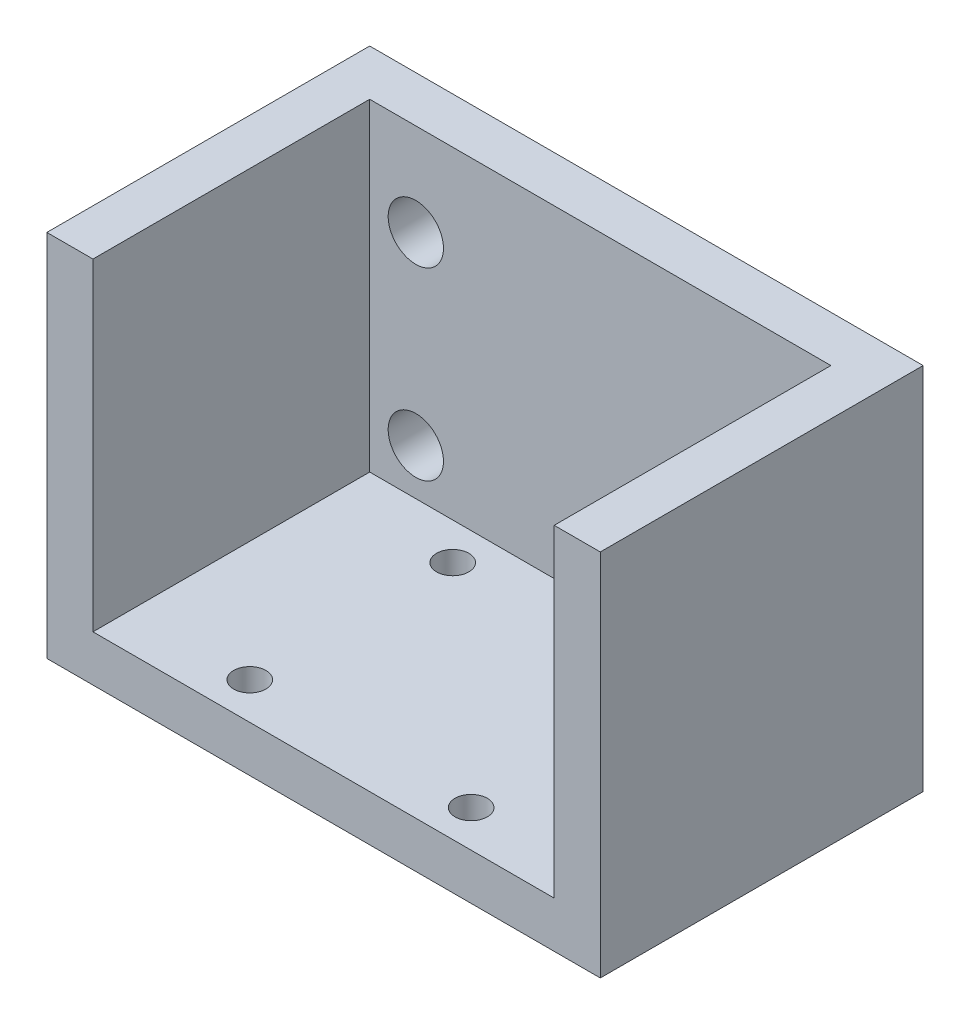
ISO-10303-21;
HEADER;
FILE_DESCRIPTION(('STEP AP214'),'2;1');
FILE_NAME('part.step','',(''),(''),'','','');
FILE_SCHEMA(('AUTOMOTIVE_DESIGN { 1 0 10303 214 1 1 1 1 }'));
ENDSEC;
DATA;
#1=APPLICATION_CONTEXT('core data for automotive mechanical design processes');
#2=APPLICATION_PROTOCOL_DEFINITION('international standard','automotive_design',2000,#1);
#3=PRODUCT_CONTEXT('',#1,'mechanical');
#4=PRODUCT('Part','Part','',(#3));
#5=PRODUCT_RELATED_PRODUCT_CATEGORY('part','',(#4));
#6=PRODUCT_DEFINITION_FORMATION('','',#4);
#7=PRODUCT_DEFINITION_CONTEXT('part definition',#1,'design');
#8=PRODUCT_DEFINITION('design','',#6,#7);
#9=PRODUCT_DEFINITION_SHAPE('','',#8);
#10=(LENGTH_UNIT() NAMED_UNIT(*) SI_UNIT(.MILLI.,.METRE.));
#11=(NAMED_UNIT(*) PLANE_ANGLE_UNIT() SI_UNIT($,.RADIAN.));
#12=(NAMED_UNIT(*) SI_UNIT($,.STERADIAN.) SOLID_ANGLE_UNIT());
#13=UNCERTAINTY_MEASURE_WITH_UNIT(LENGTH_MEASURE(1.E-05),#10,'distance_accuracy_value','');
#14=(GEOMETRIC_REPRESENTATION_CONTEXT(3) GLOBAL_UNCERTAINTY_ASSIGNED_CONTEXT((#13)) GLOBAL_UNIT_ASSIGNED_CONTEXT((#10,
#11,#12)) REPRESENTATION_CONTEXT('',''));
#15=CARTESIAN_POINT('',(0.,0.,0.));
#16=DIRECTION('',(0.,0.,1.));
#17=DIRECTION('',(1.,0.,0.));
#18=AXIS2_PLACEMENT_3D('',#15,#16,#17);
#19=CARTESIAN_POINT('',(0.,5.,0.));
#20=DIRECTION('',(0.,-1.,0.));
#21=DIRECTION('',(0.,0.,-1.));
#22=AXIS2_PLACEMENT_3D('',#19,#20,#21);
#23=PLANE('',#22);
#24=CARTESIAN_POINT('',(18.,5.,-26.));
#25=DIRECTION('',(0.,-1.,0.));
#26=DIRECTION('',(0.,0.,-1.));
#27=AXIS2_PLACEMENT_3D('',#24,#25,#26);
#28=CIRCLE('',#27,1.75);
#29=CARTESIAN_POINT('',(18.,5.,-27.75));
#30=VERTEX_POINT('',#29);
#31=EDGE_CURVE('E361',#30,#30,#28,.F.);
#32=ORIENTED_EDGE('',*,*,#31,.F.);
#33=EDGE_LOOP('',(#32));
#34=FACE_BOUND('',#33,.T.);
#35=CARTESIAN_POINT('',(18.,5.,-4.00000000000001));
#36=DIRECTION('',(0.,-1.,0.));
#37=DIRECTION('',(0.,0.,-1.));
#38=AXIS2_PLACEMENT_3D('',#35,#36,#37);
#39=CIRCLE('',#38,1.75);
#40=CARTESIAN_POINT('',(18.,5.,-5.75000000000001));
#41=VERTEX_POINT('',#40);
#42=EDGE_CURVE('E365',#41,#41,#39,.F.);
#43=ORIENTED_EDGE('',*,*,#42,.F.);
#44=EDGE_LOOP('',(#43));
#45=FACE_BOUND('',#44,.T.);
#46=CARTESIAN_POINT('',(42.,5.,-4.00000000000001));
#47=DIRECTION('',(0.,-1.,0.));
#48=DIRECTION('',(0.,0.,-1.));
#49=AXIS2_PLACEMENT_3D('',#46,#47,#48);
#50=CIRCLE('',#49,1.75);
#51=CARTESIAN_POINT('',(42.,5.,-5.75000000000001));
#52=VERTEX_POINT('',#51);
#53=EDGE_CURVE('E374',#52,#52,#50,.F.);
#54=ORIENTED_EDGE('',*,*,#53,.F.);
#55=EDGE_LOOP('',(#54));
#56=FACE_BOUND('',#55,.T.);
#57=CARTESIAN_POINT('',(42.,5.,-26.));
#58=DIRECTION('',(0.,-1.,0.));
#59=DIRECTION('',(0.,0.,-1.));
#60=AXIS2_PLACEMENT_3D('',#57,#58,#59);
#61=CIRCLE('',#60,1.75);
#62=CARTESIAN_POINT('',(42.,5.,-27.75));
#63=VERTEX_POINT('',#62);
#64=EDGE_CURVE('E383',#63,#63,#61,.F.);
#65=ORIENTED_EDGE('',*,*,#64,.F.);
#66=EDGE_LOOP('',(#65));
#67=FACE_BOUND('',#66,.T.);
#68=DIRECTION('',(0.,0.,-1.));
#69=VECTOR('',#68,1.);
#70=CARTESIAN_POINT('',(5.00000000000001,5.,0.));
#71=LINE('',#70,#69);
#72=CARTESIAN_POINT('',(5.00000000000001,5.,0.));
#73=VERTEX_POINT('',#72);
#74=CARTESIAN_POINT('',(5.,5.,-30.));
#75=VERTEX_POINT('',#74);
#76=EDGE_CURVE('E121',#73,#75,#71,.T.);
#77=ORIENTED_EDGE('',*,*,#76,.F.);
#78=DIRECTION('',(1.,0.,0.));
#79=VECTOR('',#78,1.);
#80=CARTESIAN_POINT('',(0.,5.,0.));
#81=LINE('',#80,#79);
#82=CARTESIAN_POINT('',(55.,5.,0.));
#83=VERTEX_POINT('',#82);
#84=EDGE_CURVE('E54',#73,#83,#81,.T.);
#85=ORIENTED_EDGE('',*,*,#84,.T.);
#86=DIRECTION('',(0.,0.,1.));
#87=VECTOR('',#86,1.);
#88=CARTESIAN_POINT('',(55.,5.,-30.));
#89=LINE('',#88,#87);
#90=CARTESIAN_POINT('',(55.,5.,-30.));
#91=VERTEX_POINT('',#90);
#92=EDGE_CURVE('E118',#91,#83,#89,.T.);
#93=ORIENTED_EDGE('',*,*,#92,.F.);
#94=DIRECTION('',(1.,0.,0.));
#95=VECTOR('',#94,1.);
#96=CARTESIAN_POINT('',(5.,5.,-30.));
#97=LINE('',#96,#95);
#98=EDGE_CURVE('E49',#75,#91,#97,.T.);
#99=ORIENTED_EDGE('',*,*,#98,.F.);
#100=EDGE_LOOP('',(#77,#85,#93,#99));
#101=FACE_BOUND('',#100,.T.);
#102=ADVANCED_FACE('F34',(#34,#45,#56,#67,#101),#23,.F.);
#103=CARTESIAN_POINT('',(0.,5.,0.));
#104=DIRECTION('',(1.,0.,0.));
#105=DIRECTION('',(0.,0.,-1.));
#106=AXIS2_PLACEMENT_3D('',#103,#104,#105);
#107=PLANE('',#106);
#108=DIRECTION('',(0.,0.,1.));
#109=VECTOR('',#108,1.);
#110=CARTESIAN_POINT('',(0.,0.,0.));
#111=LINE('',#110,#109);
#112=CARTESIAN_POINT('',(0.,0.,-35.));
#113=VERTEX_POINT('',#112);
#114=CARTESIAN_POINT('',(0.,0.,0.));
#115=VERTEX_POINT('',#114);
#116=EDGE_CURVE('E122',#113,#115,#111,.T.);
#117=ORIENTED_EDGE('',*,*,#116,.T.);
#118=DIRECTION('',(0.,-1.,0.));
#119=VECTOR('',#118,1.);
#120=CARTESIAN_POINT('',(0.,5.,0.));
#121=LINE('',#120,#119);
#122=CARTESIAN_POINT('',(0.,40.,0.));
#123=VERTEX_POINT('',#122);
#124=EDGE_CURVE('E11',#123,#115,#121,.T.);
#125=ORIENTED_EDGE('',*,*,#124,.F.);
#126=DIRECTION('',(0.,0.,1.));
#127=VECTOR('',#126,1.);
#128=CARTESIAN_POINT('',(0.,40.,-35.));
#129=LINE('',#128,#127);
#130=CARTESIAN_POINT('',(0.,40.,-35.));
#131=VERTEX_POINT('',#130);
#132=EDGE_CURVE('E162',#131,#123,#129,.T.);
#133=ORIENTED_EDGE('',*,*,#132,.F.);
#134=DIRECTION('',(0.,-1.,0.));
#135=VECTOR('',#134,1.);
#136=CARTESIAN_POINT('',(0.,5.,-35.));
#137=LINE('',#136,#135);
#138=EDGE_CURVE('E131',#131,#113,#137,.T.);
#139=ORIENTED_EDGE('',*,*,#138,.T.);
#140=EDGE_LOOP('',(#117,#125,#133,#139));
#141=FACE_BOUND('',#140,.T.);
#142=ADVANCED_FACE('F36',(#141),#107,.F.);
#143=CARTESIAN_POINT('',(0.,5.,0.));
#144=DIRECTION('',(0.,0.,-1.));
#145=DIRECTION('',(-1.,0.,0.));
#146=AXIS2_PLACEMENT_3D('',#143,#144,#145);
#147=PLANE('',#146);
#148=DIRECTION('',(1.,0.,0.));
#149=VECTOR('',#148,1.);
#150=CARTESIAN_POINT('',(0.,0.,0.));
#151=LINE('',#150,#149);
#152=CARTESIAN_POINT('',(60.,0.,0.));
#153=VERTEX_POINT('',#152);
#154=EDGE_CURVE('E125',#115,#153,#151,.T.);
#155=ORIENTED_EDGE('',*,*,#154,.T.);
#156=DIRECTION('',(0.,-1.,0.));
#157=VECTOR('',#156,1.);
#158=CARTESIAN_POINT('',(60.,5.,0.));
#159=LINE('',#158,#157);
#160=CARTESIAN_POINT('',(60.,40.,0.));
#161=VERTEX_POINT('',#160);
#162=EDGE_CURVE('E42',#161,#153,#159,.T.);
#163=ORIENTED_EDGE('',*,*,#162,.F.);
#164=DIRECTION('',(1.,0.,0.));
#165=VECTOR('',#164,1.);
#166=CARTESIAN_POINT('',(55.,40.,0.));
#167=LINE('',#166,#165);
#168=CARTESIAN_POINT('',(55.,40.,0.));
#169=VERTEX_POINT('',#168);
#170=EDGE_CURVE('E177',#169,#161,#167,.T.);
#171=ORIENTED_EDGE('',*,*,#170,.F.);
#172=DIRECTION('',(0.,-1.,0.));
#173=VECTOR('',#172,1.);
#174=CARTESIAN_POINT('',(55.,40.,0.));
#175=LINE('',#174,#173);
#176=EDGE_CURVE('E127',#169,#83,#175,.T.);
#177=ORIENTED_EDGE('',*,*,#176,.T.);
#178=ORIENTED_EDGE('',*,*,#84,.F.);
#179=DIRECTION('',(0.,-1.,0.));
#180=VECTOR('',#179,1.);
#181=CARTESIAN_POINT('',(5.00000000000001,40.,0.));
#182=LINE('',#181,#180);
#183=CARTESIAN_POINT('',(5.00000000000001,40.,0.));
#184=VERTEX_POINT('',#183);
#185=EDGE_CURVE('E165',#184,#73,#182,.T.);
#186=ORIENTED_EDGE('',*,*,#185,.F.);
#187=DIRECTION('',(1.,0.,0.));
#188=VECTOR('',#187,1.);
#189=CARTESIAN_POINT('',(0.,40.,0.));
#190=LINE('',#189,#188);
#191=EDGE_CURVE('E114',#123,#184,#190,.T.);
#192=ORIENTED_EDGE('',*,*,#191,.F.);
#193=ORIENTED_EDGE('',*,*,#124,.T.);
#194=EDGE_LOOP('',(#155,#163,#171,#177,#178,#186,#192,#193));
#195=FACE_BOUND('',#194,.T.);
#196=ADVANCED_FACE('F176',(#195),#147,.F.);
#197=CARTESIAN_POINT('',(60.,5.,0.));
#198=DIRECTION('',(-1.,0.,0.));
#199=DIRECTION('',(0.,0.,1.));
#200=AXIS2_PLACEMENT_3D('',#197,#198,#199);
#201=PLANE('',#200);
#202=DIRECTION('',(0.,0.,-1.));
#203=VECTOR('',#202,1.);
#204=CARTESIAN_POINT('',(60.,0.,0.));
#205=LINE('',#204,#203);
#206=CARTESIAN_POINT('',(60.,0.,-35.));
#207=VERTEX_POINT('',#206);
#208=EDGE_CURVE('E135',#153,#207,#205,.T.);
#209=ORIENTED_EDGE('',*,*,#208,.T.);
#210=DIRECTION('',(0.,-1.,0.));
#211=VECTOR('',#210,1.);
#212=CARTESIAN_POINT('',(60.,5.,-35.));
#213=LINE('',#212,#211);
#214=CARTESIAN_POINT('',(60.,40.,-35.));
#215=VERTEX_POINT('',#214);
#216=EDGE_CURVE('E140',#215,#207,#213,.T.);
#217=ORIENTED_EDGE('',*,*,#216,.F.);
#218=DIRECTION('',(0.,0.,-1.));
#219=VECTOR('',#218,1.);
#220=CARTESIAN_POINT('',(60.,40.,0.));
#221=LINE('',#220,#219);
#222=EDGE_CURVE('E148',#161,#215,#221,.T.);
#223=ORIENTED_EDGE('',*,*,#222,.F.);
#224=ORIENTED_EDGE('',*,*,#162,.T.);
#225=EDGE_LOOP('',(#209,#217,#223,#224));
#226=FACE_BOUND('',#225,.T.);
#227=ADVANCED_FACE('F146',(#226),#201,.F.);
#228=CARTESIAN_POINT('',(0.,5.,-35.));
#229=DIRECTION('',(0.,0.,1.));
#230=DIRECTION('',(1.,0.,0.));
#231=AXIS2_PLACEMENT_3D('',#228,#229,#230);
#232=PLANE('',#231);
#233=CARTESIAN_POINT('',(10.,30.,-35.));
#234=DIRECTION('',(0.,0.,-1.));
#235=DIRECTION('',(-1.,0.,0.));
#236=AXIS2_PLACEMENT_3D('',#233,#234,#235);
#237=CIRCLE('',#236,3.);
#238=CARTESIAN_POINT('',(7.,30.,-35.));
#239=VERTEX_POINT('',#238);
#240=EDGE_CURVE('E387',#239,#239,#237,.T.);
#241=ORIENTED_EDGE('',*,*,#240,.F.);
#242=EDGE_LOOP('',(#241));
#243=FACE_BOUND('',#242,.T.);
#244=CARTESIAN_POINT('',(50.,30.,-35.));
#245=DIRECTION('',(0.,0.,-1.));
#246=DIRECTION('',(-1.,0.,0.));
#247=AXIS2_PLACEMENT_3D('',#244,#245,#246);
#248=CIRCLE('',#247,3.);
#249=CARTESIAN_POINT('',(47.,30.,-35.));
#250=VERTEX_POINT('',#249);
#251=EDGE_CURVE('E395',#250,#250,#248,.T.);
#252=ORIENTED_EDGE('',*,*,#251,.F.);
#253=EDGE_LOOP('',(#252));
#254=FACE_BOUND('',#253,.T.);
#255=CARTESIAN_POINT('',(50.,10.,-35.));
#256=DIRECTION('',(0.,0.,-1.));
#257=DIRECTION('',(-1.,0.,0.));
#258=AXIS2_PLACEMENT_3D('',#255,#256,#257);
#259=CIRCLE('',#258,3.);
#260=CARTESIAN_POINT('',(47.,10.,-35.));
#261=VERTEX_POINT('',#260);
#262=EDGE_CURVE('E386',#261,#261,#259,.T.);
#263=ORIENTED_EDGE('',*,*,#262,.F.);
#264=EDGE_LOOP('',(#263));
#265=FACE_BOUND('',#264,.T.);
#266=CARTESIAN_POINT('',(10.,10.,-35.));
#267=DIRECTION('',(0.,0.,-1.));
#268=DIRECTION('',(-1.,0.,0.));
#269=AXIS2_PLACEMENT_3D('',#266,#267,#268);
#270=CIRCLE('',#269,3.);
#271=CARTESIAN_POINT('',(7.,10.,-35.));
#272=VERTEX_POINT('',#271);
#273=EDGE_CURVE('E394',#272,#272,#270,.T.);
#274=ORIENTED_EDGE('',*,*,#273,.F.);
#275=EDGE_LOOP('',(#274));
#276=FACE_BOUND('',#275,.T.);
#277=DIRECTION('',(-1.,0.,0.));
#278=VECTOR('',#277,1.);
#279=CARTESIAN_POINT('',(0.,0.,-35.));
#280=LINE('',#279,#278);
#281=EDGE_CURVE('E132',#207,#113,#280,.T.);
#282=ORIENTED_EDGE('',*,*,#281,.T.);
#283=ORIENTED_EDGE('',*,*,#138,.F.);
#284=DIRECTION('',(-1.,0.,0.));
#285=VECTOR('',#284,1.);
#286=CARTESIAN_POINT('',(60.,40.,-35.));
#287=LINE('',#286,#285);
#288=EDGE_CURVE('E163',#215,#131,#287,.T.);
#289=ORIENTED_EDGE('',*,*,#288,.F.);
#290=ORIENTED_EDGE('',*,*,#216,.T.);
#291=EDGE_LOOP('',(#282,#283,#289,#290));
#292=FACE_BOUND('',#291,.T.);
#293=ADVANCED_FACE('F157',(#243,#254,#265,#276,#292),#232,.F.);
#294=CARTESIAN_POINT('',(0.,0.,0.));
#295=DIRECTION('',(0.,-1.,0.));
#296=DIRECTION('',(0.,0.,-1.));
#297=AXIS2_PLACEMENT_3D('',#294,#295,#296);
#298=PLANE('',#297);
#299=CARTESIAN_POINT('',(18.,0.,-26.));
#300=DIRECTION('',(0.,-1.,0.));
#301=DIRECTION('',(0.,0.,-1.));
#302=AXIS2_PLACEMENT_3D('',#299,#300,#301);
#303=CIRCLE('',#302,1.75);
#304=CARTESIAN_POINT('',(18.,0.,-27.75));
#305=VERTEX_POINT('',#304);
#306=EDGE_CURVE('E364',#305,#305,#303,.T.);
#307=ORIENTED_EDGE('',*,*,#306,.F.);
#308=EDGE_LOOP('',(#307));
#309=FACE_BOUND('',#308,.T.);
#310=CARTESIAN_POINT('',(18.,0.,-4.00000000000001));
#311=DIRECTION('',(0.,-1.,0.));
#312=DIRECTION('',(0.,0.,-1.));
#313=AXIS2_PLACEMENT_3D('',#310,#311,#312);
#314=CIRCLE('',#313,1.75);
#315=CARTESIAN_POINT('',(18.,0.,-5.75000000000001));
#316=VERTEX_POINT('',#315);
#317=EDGE_CURVE('E370',#316,#316,#314,.T.);
#318=ORIENTED_EDGE('',*,*,#317,.F.);
#319=EDGE_LOOP('',(#318));
#320=FACE_BOUND('',#319,.T.);
#321=CARTESIAN_POINT('',(42.,0.,-4.00000000000001));
#322=DIRECTION('',(0.,-1.,0.));
#323=DIRECTION('',(0.,0.,-1.));
#324=AXIS2_PLACEMENT_3D('',#321,#322,#323);
#325=CIRCLE('',#324,1.75);
#326=CARTESIAN_POINT('',(42.,0.,-5.75000000000001));
#327=VERTEX_POINT('',#326);
#328=EDGE_CURVE('E376',#327,#327,#325,.T.);
#329=ORIENTED_EDGE('',*,*,#328,.F.);
#330=EDGE_LOOP('',(#329));
#331=FACE_BOUND('',#330,.T.);
#332=CARTESIAN_POINT('',(42.,0.,-26.));
#333=DIRECTION('',(0.,-1.,0.));
#334=DIRECTION('',(0.,0.,-1.));
#335=AXIS2_PLACEMENT_3D('',#332,#333,#334);
#336=CIRCLE('',#335,1.75);
#337=CARTESIAN_POINT('',(42.,0.,-27.75));
#338=VERTEX_POINT('',#337);
#339=EDGE_CURVE('E367',#338,#338,#336,.T.);
#340=ORIENTED_EDGE('',*,*,#339,.F.);
#341=EDGE_LOOP('',(#340));
#342=FACE_BOUND('',#341,.T.);
#343=ORIENTED_EDGE('',*,*,#116,.F.);
#344=ORIENTED_EDGE('',*,*,#281,.F.);
#345=ORIENTED_EDGE('',*,*,#208,.F.);
#346=ORIENTED_EDGE('',*,*,#154,.F.);
#347=EDGE_LOOP('',(#343,#344,#345,#346));
#348=FACE_BOUND('',#347,.T.);
#349=ADVANCED_FACE('F155',(#309,#320,#331,#342,#348),#298,.T.);
#350=CARTESIAN_POINT('',(5.00000000000001,40.,0.));
#351=DIRECTION('',(-1.,0.,0.));
#352=DIRECTION('',(0.,0.,1.));
#353=AXIS2_PLACEMENT_3D('',#350,#351,#352);
#354=PLANE('',#353);
#355=ORIENTED_EDGE('',*,*,#76,.T.);
#356=DIRECTION('',(0.,-1.,0.));
#357=VECTOR('',#356,1.);
#358=CARTESIAN_POINT('',(5.,40.,-30.));
#359=LINE('',#358,#357);
#360=CARTESIAN_POINT('',(5.,40.,-30.));
#361=VERTEX_POINT('',#360);
#362=EDGE_CURVE('E101',#361,#75,#359,.T.);
#363=ORIENTED_EDGE('',*,*,#362,.F.);
#364=DIRECTION('',(0.,0.,-1.));
#365=VECTOR('',#364,1.);
#366=CARTESIAN_POINT('',(5.00000000000001,40.,0.));
#367=LINE('',#366,#365);
#368=EDGE_CURVE('E108',#184,#361,#367,.T.);
#369=ORIENTED_EDGE('',*,*,#368,.F.);
#370=ORIENTED_EDGE('',*,*,#185,.T.);
#371=EDGE_LOOP('',(#355,#363,#369,#370));
#372=FACE_BOUND('',#371,.T.);
#373=ADVANCED_FACE('F120',(#372),#354,.F.);
#374=CARTESIAN_POINT('',(5.,40.,-30.));
#375=DIRECTION('',(0.,0.,-1.));
#376=DIRECTION('',(-1.,0.,0.));
#377=AXIS2_PLACEMENT_3D('',#374,#375,#376);
#378=PLANE('',#377);
#379=CARTESIAN_POINT('',(10.,30.,-30.));
#380=DIRECTION('',(0.,0.,-1.));
#381=DIRECTION('',(-1.,0.,0.));
#382=AXIS2_PLACEMENT_3D('',#379,#380,#381);
#383=CIRCLE('',#382,3.);
#384=CARTESIAN_POINT('',(7.,30.,-30.));
#385=VERTEX_POINT('',#384);
#386=EDGE_CURVE('E390',#385,#385,#383,.F.);
#387=ORIENTED_EDGE('',*,*,#386,.F.);
#388=EDGE_LOOP('',(#387));
#389=FACE_BOUND('',#388,.T.);
#390=CARTESIAN_POINT('',(50.,30.,-30.));
#391=DIRECTION('',(0.,0.,-1.));
#392=DIRECTION('',(-1.,0.,0.));
#393=AXIS2_PLACEMENT_3D('',#390,#391,#392);
#394=CIRCLE('',#393,3.);
#395=CARTESIAN_POINT('',(47.,30.,-30.));
#396=VERTEX_POINT('',#395);
#397=EDGE_CURVE('E391',#396,#396,#394,.F.);
#398=ORIENTED_EDGE('',*,*,#397,.F.);
#399=EDGE_LOOP('',(#398));
#400=FACE_BOUND('',#399,.T.);
#401=CARTESIAN_POINT('',(50.,10.,-30.));
#402=DIRECTION('',(0.,0.,-1.));
#403=DIRECTION('',(-1.,0.,0.));
#404=AXIS2_PLACEMENT_3D('',#401,#402,#403);
#405=CIRCLE('',#404,3.);
#406=CARTESIAN_POINT('',(47.,10.,-30.));
#407=VERTEX_POINT('',#406);
#408=EDGE_CURVE('E398',#407,#407,#405,.F.);
#409=ORIENTED_EDGE('',*,*,#408,.F.);
#410=EDGE_LOOP('',(#409));
#411=FACE_BOUND('',#410,.T.);
#412=CARTESIAN_POINT('',(10.,10.,-30.));
#413=DIRECTION('',(0.,0.,-1.));
#414=DIRECTION('',(-1.,0.,0.));
#415=AXIS2_PLACEMENT_3D('',#412,#413,#414);
#416=CIRCLE('',#415,3.);
#417=CARTESIAN_POINT('',(7.,10.,-30.));
#418=VERTEX_POINT('',#417);
#419=EDGE_CURVE('E171',#418,#418,#416,.F.);
#420=ORIENTED_EDGE('',*,*,#419,.F.);
#421=EDGE_LOOP('',(#420));
#422=FACE_BOUND('',#421,.T.);
#423=ORIENTED_EDGE('',*,*,#98,.T.);
#424=DIRECTION('',(0.,-1.,0.));
#425=VECTOR('',#424,1.);
#426=CARTESIAN_POINT('',(55.,40.,-30.));
#427=LINE('',#426,#425);
#428=CARTESIAN_POINT('',(55.,40.,-30.));
#429=VERTEX_POINT('',#428);
#430=EDGE_CURVE('E104',#429,#91,#427,.T.);
#431=ORIENTED_EDGE('',*,*,#430,.F.);
#432=DIRECTION('',(1.,0.,0.));
#433=VECTOR('',#432,1.);
#434=CARTESIAN_POINT('',(5.,40.,-30.));
#435=LINE('',#434,#433);
#436=EDGE_CURVE('E97',#361,#429,#435,.T.);
#437=ORIENTED_EDGE('',*,*,#436,.F.);
#438=ORIENTED_EDGE('',*,*,#362,.T.);
#439=EDGE_LOOP('',(#423,#431,#437,#438));
#440=FACE_BOUND('',#439,.T.);
#441=ADVANCED_FACE('F99',(#389,#400,#411,#422,#440),#378,.F.);
#442=CARTESIAN_POINT('',(55.,40.,-30.));
#443=DIRECTION('',(1.,0.,0.));
#444=DIRECTION('',(0.,0.,-1.));
#445=AXIS2_PLACEMENT_3D('',#442,#443,#444);
#446=PLANE('',#445);
#447=ORIENTED_EDGE('',*,*,#92,.T.);
#448=ORIENTED_EDGE('',*,*,#176,.F.);
#449=DIRECTION('',(0.,0.,1.));
#450=VECTOR('',#449,1.);
#451=CARTESIAN_POINT('',(55.,40.,-30.));
#452=LINE('',#451,#450);
#453=EDGE_CURVE('E107',#429,#169,#452,.T.);
#454=ORIENTED_EDGE('',*,*,#453,.F.);
#455=ORIENTED_EDGE('',*,*,#430,.T.);
#456=EDGE_LOOP('',(#447,#448,#454,#455));
#457=FACE_BOUND('',#456,.T.);
#458=ADVANCED_FACE('F179',(#457),#446,.F.);
#459=CARTESIAN_POINT('',(0.,40.,0.));
#460=DIRECTION('',(0.,-1.,0.));
#461=DIRECTION('',(0.,0.,-1.));
#462=AXIS2_PLACEMENT_3D('',#459,#460,#461);
#463=PLANE('',#462);
#464=ORIENTED_EDGE('',*,*,#368,.T.);
#465=ORIENTED_EDGE('',*,*,#436,.T.);
#466=ORIENTED_EDGE('',*,*,#453,.T.);
#467=ORIENTED_EDGE('',*,*,#170,.T.);
#468=ORIENTED_EDGE('',*,*,#222,.T.);
#469=ORIENTED_EDGE('',*,*,#288,.T.);
#470=ORIENTED_EDGE('',*,*,#132,.T.);
#471=ORIENTED_EDGE('',*,*,#191,.T.);
#472=EDGE_LOOP('',(#464,#465,#466,#467,#468,#469,#470,#471));
#473=FACE_BOUND('',#472,.T.);
#474=ADVANCED_FACE('F111',(#473),#463,.F.);
#475=CARTESIAN_POINT('',(10.,10.,-21.5147186257614));
#476=DIRECTION('',(0.,0.,-1.));
#477=DIRECTION('',(-1.,0.,0.));
#478=AXIS2_PLACEMENT_3D('',#475,#476,#477);
#479=CYLINDRICAL_SURFACE('',#478,3.);
#480=ORIENTED_EDGE('',*,*,#419,.T.);
#481=EDGE_LOOP('',(#480));
#482=FACE_BOUND('',#481,.T.);
#483=ORIENTED_EDGE('',*,*,#273,.T.);
#484=EDGE_LOOP('',(#483));
#485=FACE_BOUND('',#484,.T.);
#486=ADVANCED_FACE('F240',(#482,#485),#479,.F.);
#487=CARTESIAN_POINT('',(50.,10.,-21.5147186257614));
#488=DIRECTION('',(0.,0.,-1.));
#489=DIRECTION('',(-1.,0.,0.));
#490=AXIS2_PLACEMENT_3D('',#487,#488,#489);
#491=CYLINDRICAL_SURFACE('',#490,3.);
#492=ORIENTED_EDGE('',*,*,#408,.T.);
#493=EDGE_LOOP('',(#492));
#494=FACE_BOUND('',#493,.T.);
#495=ORIENTED_EDGE('',*,*,#262,.T.);
#496=EDGE_LOOP('',(#495));
#497=FACE_BOUND('',#496,.T.);
#498=ADVANCED_FACE('F246',(#494,#497),#491,.F.);
#499=CARTESIAN_POINT('',(50.,30.,-21.5147186257614));
#500=DIRECTION('',(0.,0.,-1.));
#501=DIRECTION('',(-1.,0.,0.));
#502=AXIS2_PLACEMENT_3D('',#499,#500,#501);
#503=CYLINDRICAL_SURFACE('',#502,3.);
#504=ORIENTED_EDGE('',*,*,#397,.T.);
#505=EDGE_LOOP('',(#504));
#506=FACE_BOUND('',#505,.T.);
#507=ORIENTED_EDGE('',*,*,#251,.T.);
#508=EDGE_LOOP('',(#507));
#509=FACE_BOUND('',#508,.T.);
#510=ADVANCED_FACE('F254',(#506,#509),#503,.F.);
#511=CARTESIAN_POINT('',(10.,30.,-21.5147186257614));
#512=DIRECTION('',(0.,0.,-1.));
#513=DIRECTION('',(-1.,0.,0.));
#514=AXIS2_PLACEMENT_3D('',#511,#512,#513);
#515=CYLINDRICAL_SURFACE('',#514,3.);
#516=ORIENTED_EDGE('',*,*,#386,.T.);
#517=EDGE_LOOP('',(#516));
#518=FACE_BOUND('',#517,.T.);
#519=ORIENTED_EDGE('',*,*,#240,.T.);
#520=EDGE_LOOP('',(#519));
#521=FACE_BOUND('',#520,.T.);
#522=ADVANCED_FACE('F262',(#518,#521),#515,.F.);
#523=CARTESIAN_POINT('',(42.,9.94974746830584,-26.));
#524=DIRECTION('',(0.,-1.,0.));
#525=DIRECTION('',(0.,0.,-1.));
#526=AXIS2_PLACEMENT_3D('',#523,#524,#525);
#527=CYLINDRICAL_SURFACE('',#526,1.75);
#528=ORIENTED_EDGE('',*,*,#64,.T.);
#529=EDGE_LOOP('',(#528));
#530=FACE_BOUND('',#529,.T.);
#531=ORIENTED_EDGE('',*,*,#339,.T.);
#532=EDGE_LOOP('',(#531));
#533=FACE_BOUND('',#532,.T.);
#534=ADVANCED_FACE('F270',(#530,#533),#527,.F.);
#535=CARTESIAN_POINT('',(42.,9.94974746830584,-4.00000000000001));
#536=DIRECTION('',(0.,-1.,0.));
#537=DIRECTION('',(0.,0.,-1.));
#538=AXIS2_PLACEMENT_3D('',#535,#536,#537);
#539=CYLINDRICAL_SURFACE('',#538,1.75);
#540=ORIENTED_EDGE('',*,*,#53,.T.);
#541=EDGE_LOOP('',(#540));
#542=FACE_BOUND('',#541,.T.);
#543=ORIENTED_EDGE('',*,*,#328,.T.);
#544=EDGE_LOOP('',(#543));
#545=FACE_BOUND('',#544,.T.);
#546=ADVANCED_FACE('F277',(#542,#545),#539,.F.);
#547=CARTESIAN_POINT('',(18.,9.94974746830584,-4.00000000000001));
#548=DIRECTION('',(0.,-1.,0.));
#549=DIRECTION('',(0.,0.,-1.));
#550=AXIS2_PLACEMENT_3D('',#547,#548,#549);
#551=CYLINDRICAL_SURFACE('',#550,1.75);
#552=ORIENTED_EDGE('',*,*,#42,.T.);
#553=EDGE_LOOP('',(#552));
#554=FACE_BOUND('',#553,.T.);
#555=ORIENTED_EDGE('',*,*,#317,.T.);
#556=EDGE_LOOP('',(#555));
#557=FACE_BOUND('',#556,.T.);
#558=ADVANCED_FACE('F285',(#554,#557),#551,.F.);
#559=CARTESIAN_POINT('',(18.,9.94974746830584,-26.));
#560=DIRECTION('',(0.,-1.,0.));
#561=DIRECTION('',(0.,0.,-1.));
#562=AXIS2_PLACEMENT_3D('',#559,#560,#561);
#563=CYLINDRICAL_SURFACE('',#562,1.75);
#564=ORIENTED_EDGE('',*,*,#31,.T.);
#565=EDGE_LOOP('',(#564));
#566=FACE_BOUND('',#565,.T.);
#567=ORIENTED_EDGE('',*,*,#306,.T.);
#568=EDGE_LOOP('',(#567));
#569=FACE_BOUND('',#568,.T.);
#570=ADVANCED_FACE('F293',(#566,#569),#563,.F.);
#571=CLOSED_SHELL('',(#102,#142,#196,#227,#293,#349,#373,#441,#458,#474,#486,#498,#510,#522,
#534,#546,#558,#570));
#572=MANIFOLD_SOLID_BREP('B2',#571);
#573=ADVANCED_BREP_SHAPE_REPRESENTATION('',(#18,#572),#14);
#574=SHAPE_DEFINITION_REPRESENTATION(#9,#573);
ENDSEC;
END-ISO-10303-21;
